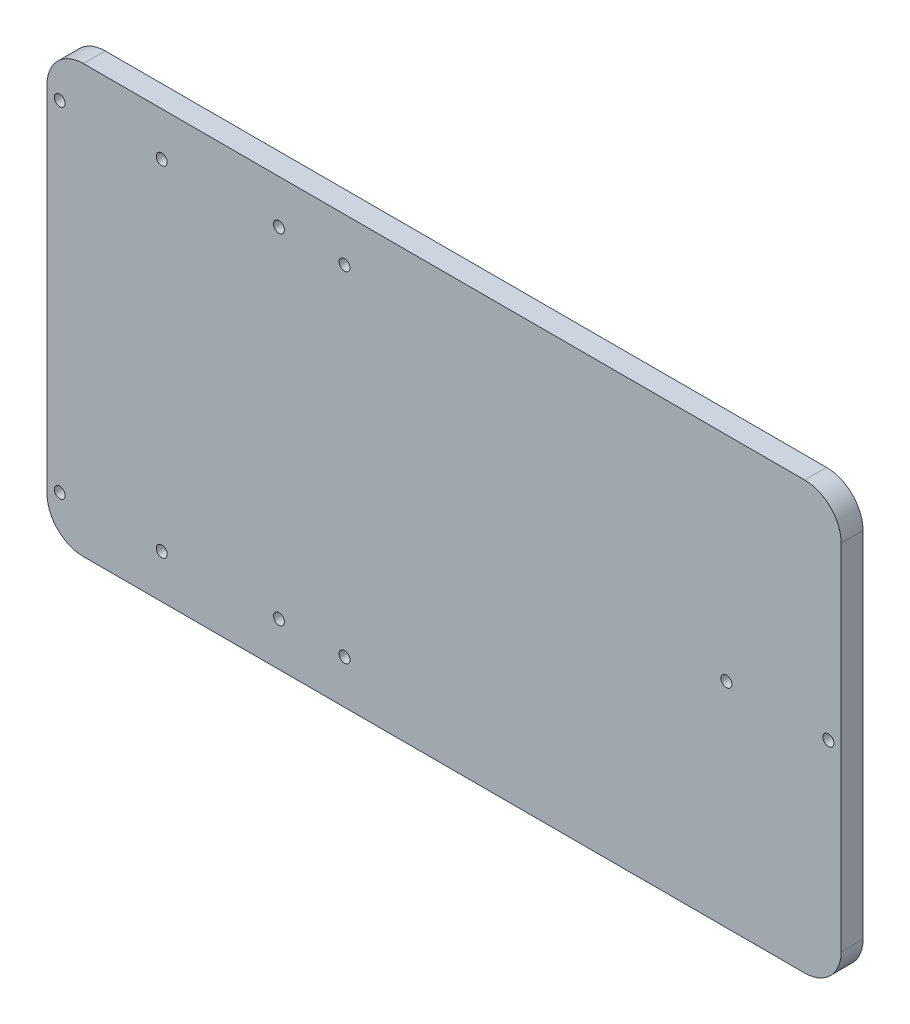
ISO-10303-21;
HEADER;
FILE_DESCRIPTION(('STEP AP214'),'2;1');
FILE_NAME('part.step','',(''),(''),'','','');
FILE_SCHEMA(('AUTOMOTIVE_DESIGN { 1 0 10303 214 1 1 1 1 }'));
ENDSEC;
DATA;
#1=APPLICATION_CONTEXT('core data for automotive mechanical design processes');
#2=APPLICATION_PROTOCOL_DEFINITION('international standard','automotive_design',2000,#1);
#3=PRODUCT_CONTEXT('',#1,'mechanical');
#4=PRODUCT('Part','Part','',(#3));
#5=PRODUCT_RELATED_PRODUCT_CATEGORY('part','',(#4));
#6=PRODUCT_DEFINITION_FORMATION('','',#4);
#7=PRODUCT_DEFINITION_CONTEXT('part definition',#1,'design');
#8=PRODUCT_DEFINITION('design','',#6,#7);
#9=PRODUCT_DEFINITION_SHAPE('','',#8);
#10=(LENGTH_UNIT() NAMED_UNIT(*) SI_UNIT(.MILLI.,.METRE.));
#11=(NAMED_UNIT(*) PLANE_ANGLE_UNIT() SI_UNIT($,.RADIAN.));
#12=(NAMED_UNIT(*) SI_UNIT($,.STERADIAN.) SOLID_ANGLE_UNIT());
#13=UNCERTAINTY_MEASURE_WITH_UNIT(LENGTH_MEASURE(1.E-05),#10,'distance_accuracy_value','');
#14=(GEOMETRIC_REPRESENTATION_CONTEXT(3) GLOBAL_UNCERTAINTY_ASSIGNED_CONTEXT((#13)) GLOBAL_UNIT_ASSIGNED_CONTEXT((#10,
#11,#12)) REPRESENTATION_CONTEXT('',''));
#15=CARTESIAN_POINT('',(0.,0.,0.));
#16=DIRECTION('',(0.,0.,1.));
#17=DIRECTION('',(1.,0.,0.));
#18=AXIS2_PLACEMENT_3D('',#15,#16,#17);
#19=CARTESIAN_POINT('',(0.,0.,6.));
#20=DIRECTION('',(0.,0.,1.));
#21=DIRECTION('',(1.,0.,0.));
#22=AXIS2_PLACEMENT_3D('',#19,#20,#21);
#23=PLANE('',#22);
#24=CARTESIAN_POINT('',(-177.942511077423,244.343600407328,6.));
#25=DIRECTION('',(0.,0.,1.));
#26=DIRECTION('',(1.,0.,0.));
#27=AXIS2_PLACEMENT_3D('',#24,#25,#26);
#28=CIRCLE('',#27,1.5);
#29=CARTESIAN_POINT('',(-176.442511077423,244.343600407328,6.));
#30=VERTEX_POINT('',#29);
#31=EDGE_CURVE('E311',#30,#30,#28,.T.);
#32=ORIENTED_EDGE('',*,*,#31,.F.);
#33=EDGE_LOOP('',(#32));
#34=FACE_BOUND('',#33,.T.);
#35=CARTESIAN_POINT('',(-195.942511077423,244.343600407328,6.));
#36=DIRECTION('',(0.,0.,1.));
#37=DIRECTION('',(1.,0.,0.));
#38=AXIS2_PLACEMENT_3D('',#35,#36,#37);
#39=CIRCLE('',#38,1.5);
#40=CARTESIAN_POINT('',(-194.442511077423,244.343600407328,6.));
#41=VERTEX_POINT('',#40);
#42=EDGE_CURVE('E305',#41,#41,#39,.T.);
#43=ORIENTED_EDGE('',*,*,#42,.F.);
#44=EDGE_LOOP('',(#43));
#45=FACE_BOUND('',#44,.T.);
#46=CARTESIAN_POINT('',(-177.942511077423,151.143600407328,6.));
#47=DIRECTION('',(0.,0.,1.));
#48=DIRECTION('',(1.,0.,0.));
#49=AXIS2_PLACEMENT_3D('',#46,#47,#48);
#50=CIRCLE('',#49,1.5);
#51=CARTESIAN_POINT('',(-176.442511077423,151.143600407328,6.));
#52=VERTEX_POINT('',#51);
#53=EDGE_CURVE('E299',#52,#52,#50,.T.);
#54=ORIENTED_EDGE('',*,*,#53,.F.);
#55=EDGE_LOOP('',(#54));
#56=FACE_BOUND('',#55,.T.);
#57=CARTESIAN_POINT('',(-195.942511077423,151.143600407328,6.));
#58=DIRECTION('',(0.,0.,1.));
#59=DIRECTION('',(1.,0.,0.));
#60=AXIS2_PLACEMENT_3D('',#57,#58,#59);
#61=CIRCLE('',#60,1.5);
#62=CARTESIAN_POINT('',(-194.442511077423,151.143600407328,6.));
#63=VERTEX_POINT('',#62);
#64=EDGE_CURVE('E296',#63,#63,#61,.T.);
#65=ORIENTED_EDGE('',*,*,#64,.F.);
#66=EDGE_LOOP('',(#65));
#67=FACE_BOUND('',#66,.T.);
#68=CARTESIAN_POINT('',(-73.1091777440896,197.743600407328,6.));
#69=DIRECTION('',(0.,0.,1.));
#70=DIRECTION('',(1.,0.,0.));
#71=AXIS2_PLACEMENT_3D('',#68,#69,#70);
#72=CIRCLE('',#71,1.5);
#73=CARTESIAN_POINT('',(-71.6091777440896,197.743600407328,6.));
#74=VERTEX_POINT('',#73);
#75=EDGE_CURVE('E281',#74,#74,#72,.T.);
#76=ORIENTED_EDGE('',*,*,#75,.F.);
#77=EDGE_LOOP('',(#76));
#78=FACE_BOUND('',#77,.T.);
#79=CARTESIAN_POINT('',(-228.10917774409,151.143600407328,6.));
#80=DIRECTION('',(0.,0.,1.));
#81=DIRECTION('',(1.,0.,0.));
#82=AXIS2_PLACEMENT_3D('',#79,#80,#81);
#83=CIRCLE('',#82,1.5);
#84=CARTESIAN_POINT('',(-226.60917774409,151.143600407328,6.));
#85=VERTEX_POINT('',#84);
#86=EDGE_CURVE('E269',#85,#85,#83,.T.);
#87=ORIENTED_EDGE('',*,*,#86,.F.);
#88=EDGE_LOOP('',(#87));
#89=FACE_BOUND('',#88,.T.);
#90=CARTESIAN_POINT('',(-256.10917774409,244.343600407328,6.));
#91=DIRECTION('',(0.,0.,1.));
#92=DIRECTION('',(1.,0.,0.));
#93=AXIS2_PLACEMENT_3D('',#90,#91,#92);
#94=CIRCLE('',#93,1.50000000000002);
#95=CARTESIAN_POINT('',(-254.60917774409,244.343600407328,6.));
#96=VERTEX_POINT('',#95);
#97=EDGE_CURVE('E250',#96,#96,#94,.T.);
#98=ORIENTED_EDGE('',*,*,#97,.F.);
#99=EDGE_LOOP('',(#98));
#100=FACE_BOUND('',#99,.T.);
#101=DIRECTION('',(1.,0.,0.));
#102=VECTOR('',#101,1.);
#103=CARTESIAN_POINT('',(-259.60917774409,139.143600407328,6.));
#104=LINE('',#103,#102);
#105=CARTESIAN_POINT('',(-249.60917774409,139.143600407328,6.));
#106=VERTEX_POINT('',#105);
#107=CARTESIAN_POINT('',(-51.6091777440896,139.143600407328,6.));
#108=VERTEX_POINT('',#107);
#109=EDGE_CURVE('E259',#106,#108,#104,.T.);
#110=ORIENTED_EDGE('',*,*,#109,.T.);
#111=CARTESIAN_POINT('',(-51.6091777440896,149.143600407328,6.));
#112=DIRECTION('',(0.,0.,1.));
#113=DIRECTION('',(1.,0.,0.));
#114=AXIS2_PLACEMENT_3D('',#111,#112,#113);
#115=CIRCLE('',#114,10.);
#116=CARTESIAN_POINT('',(-41.6091777440896,149.143600407328,6.));
#117=VERTEX_POINT('',#116);
#118=EDGE_CURVE('E232',#108,#117,#115,.T.);
#119=ORIENTED_EDGE('',*,*,#118,.T.);
#120=DIRECTION('',(0.,-1.,0.));
#121=VECTOR('',#120,1.);
#122=CARTESIAN_POINT('',(-41.6091777440896,256.343600407328,6.));
#123=LINE('',#122,#121);
#124=CARTESIAN_POINT('',(-41.6091777440896,246.343600407328,6.));
#125=VERTEX_POINT('',#124);
#126=EDGE_CURVE('E215',#125,#117,#123,.T.);
#127=ORIENTED_EDGE('',*,*,#126,.F.);
#128=CARTESIAN_POINT('',(-51.6091777440896,246.343600407328,6.));
#129=DIRECTION('',(0.,0.,1.));
#130=DIRECTION('',(1.,0.,0.));
#131=AXIS2_PLACEMENT_3D('',#128,#129,#130);
#132=CIRCLE('',#131,10.);
#133=CARTESIAN_POINT('',(-51.6091777440896,256.343600407328,6.));
#134=VERTEX_POINT('',#133);
#135=EDGE_CURVE('E137',#125,#134,#132,.T.);
#136=ORIENTED_EDGE('',*,*,#135,.T.);
#137=DIRECTION('',(1.,0.,0.));
#138=VECTOR('',#137,1.);
#139=CARTESIAN_POINT('',(-259.60917774409,256.343600407328,6.));
#140=LINE('',#139,#138);
#141=CARTESIAN_POINT('',(-249.60917774409,256.343600407328,6.));
#142=VERTEX_POINT('',#141);
#143=EDGE_CURVE('E211',#142,#134,#140,.T.);
#144=ORIENTED_EDGE('',*,*,#143,.F.);
#145=CARTESIAN_POINT('',(-249.60917774409,246.343600407328,6.));
#146=DIRECTION('',(0.,0.,1.));
#147=DIRECTION('',(1.,0.,0.));
#148=AXIS2_PLACEMENT_3D('',#145,#146,#147);
#149=CIRCLE('',#148,10.);
#150=CARTESIAN_POINT('',(-259.60917774409,246.343600407328,6.));
#151=VERTEX_POINT('',#150);
#152=EDGE_CURVE('E227',#142,#151,#149,.T.);
#153=ORIENTED_EDGE('',*,*,#152,.T.);
#154=DIRECTION('',(0.,-1.,0.));
#155=VECTOR('',#154,1.);
#156=CARTESIAN_POINT('',(-259.60917774409,256.343600407328,6.));
#157=LINE('',#156,#155);
#158=CARTESIAN_POINT('',(-259.60917774409,149.143600407328,6.));
#159=VERTEX_POINT('',#158);
#160=EDGE_CURVE('E246',#151,#159,#157,.T.);
#161=ORIENTED_EDGE('',*,*,#160,.T.);
#162=CARTESIAN_POINT('',(-249.60917774409,149.143600407328,6.));
#163=DIRECTION('',(0.,0.,1.));
#164=DIRECTION('',(1.,0.,0.));
#165=AXIS2_PLACEMENT_3D('',#162,#163,#164);
#166=CIRCLE('',#165,10.);
#167=EDGE_CURVE('E229',#159,#106,#166,.T.);
#168=ORIENTED_EDGE('',*,*,#167,.T.);
#169=EDGE_LOOP('',(#110,#119,#127,#136,#144,#153,#161,#168));
#170=FACE_BOUND('',#169,.T.);
#171=CARTESIAN_POINT('',(-228.10917774409,244.343600407328,6.));
#172=DIRECTION('',(0.,0.,1.));
#173=DIRECTION('',(1.,0.,0.));
#174=AXIS2_PLACEMENT_3D('',#171,#172,#173);
#175=CIRCLE('',#174,1.5);
#176=CARTESIAN_POINT('',(-226.60917774409,244.343600407328,6.));
#177=VERTEX_POINT('',#176);
#178=EDGE_CURVE('E264',#177,#177,#175,.T.);
#179=ORIENTED_EDGE('',*,*,#178,.F.);
#180=EDGE_LOOP('',(#179));
#181=FACE_BOUND('',#180,.T.);
#182=CARTESIAN_POINT('',(-45.1091777440896,197.743600407328,6.));
#183=DIRECTION('',(0.,0.,1.));
#184=DIRECTION('',(1.,0.,0.));
#185=AXIS2_PLACEMENT_3D('',#182,#183,#184);
#186=CIRCLE('',#185,1.5);
#187=CARTESIAN_POINT('',(-43.6091777440896,197.743600407328,6.));
#188=VERTEX_POINT('',#187);
#189=EDGE_CURVE('E275',#188,#188,#186,.T.);
#190=ORIENTED_EDGE('',*,*,#189,.F.);
#191=EDGE_LOOP('',(#190));
#192=FACE_BOUND('',#191,.T.);
#193=CARTESIAN_POINT('',(-256.10917774409,151.143600407328,6.));
#194=DIRECTION('',(0.,0.,1.));
#195=DIRECTION('',(1.,0.,0.));
#196=AXIS2_PLACEMENT_3D('',#193,#194,#195);
#197=CIRCLE('',#196,1.50000000000002);
#198=CARTESIAN_POINT('',(-254.60917774409,151.143600407328,6.));
#199=VERTEX_POINT('',#198);
#200=EDGE_CURVE('E287',#199,#199,#197,.T.);
#201=ORIENTED_EDGE('',*,*,#200,.F.);
#202=EDGE_LOOP('',(#201));
#203=FACE_BOUND('',#202,.T.);
#204=ADVANCED_FACE('F122',(#34,#45,#56,#67,#78,#89,#100,#170,#181,#192,#203),#23,.T.);
#205=CARTESIAN_POINT('',(0.,0.,0.));
#206=DIRECTION('',(0.,0.,1.));
#207=DIRECTION('',(1.,0.,0.));
#208=AXIS2_PLACEMENT_3D('',#205,#206,#207);
#209=PLANE('',#208);
#210=CARTESIAN_POINT('',(-177.942511077423,244.343600407328,0.));
#211=DIRECTION('',(0.,0.,1.));
#212=DIRECTION('',(1.,0.,0.));
#213=AXIS2_PLACEMENT_3D('',#210,#211,#212);
#214=CIRCLE('',#213,1.5);
#215=CARTESIAN_POINT('',(-176.442511077423,244.343600407328,0.));
#216=VERTEX_POINT('',#215);
#217=EDGE_CURVE('E314',#216,#216,#214,.T.);
#218=ORIENTED_EDGE('',*,*,#217,.T.);
#219=EDGE_LOOP('',(#218));
#220=FACE_BOUND('',#219,.T.);
#221=CARTESIAN_POINT('',(-195.942511077423,244.343600407328,0.));
#222=DIRECTION('',(0.,0.,1.));
#223=DIRECTION('',(1.,0.,0.));
#224=AXIS2_PLACEMENT_3D('',#221,#222,#223);
#225=CIRCLE('',#224,1.5);
#226=CARTESIAN_POINT('',(-194.442511077423,244.343600407328,0.));
#227=VERTEX_POINT('',#226);
#228=EDGE_CURVE('E308',#227,#227,#225,.T.);
#229=ORIENTED_EDGE('',*,*,#228,.T.);
#230=EDGE_LOOP('',(#229));
#231=FACE_BOUND('',#230,.T.);
#232=CARTESIAN_POINT('',(-177.942511077423,151.143600407328,0.));
#233=DIRECTION('',(0.,0.,1.));
#234=DIRECTION('',(1.,0.,0.));
#235=AXIS2_PLACEMENT_3D('',#232,#233,#234);
#236=CIRCLE('',#235,1.5);
#237=CARTESIAN_POINT('',(-176.442511077423,151.143600407328,0.));
#238=VERTEX_POINT('',#237);
#239=EDGE_CURVE('E302',#238,#238,#236,.T.);
#240=ORIENTED_EDGE('',*,*,#239,.T.);
#241=EDGE_LOOP('',(#240));
#242=FACE_BOUND('',#241,.T.);
#243=CARTESIAN_POINT('',(-195.942511077423,151.143600407328,0.));
#244=DIRECTION('',(0.,0.,1.));
#245=DIRECTION('',(1.,0.,0.));
#246=AXIS2_PLACEMENT_3D('',#243,#244,#245);
#247=CIRCLE('',#246,1.5);
#248=CARTESIAN_POINT('',(-194.442511077423,151.143600407328,0.));
#249=VERTEX_POINT('',#248);
#250=EDGE_CURVE('E293',#249,#249,#247,.T.);
#251=ORIENTED_EDGE('',*,*,#250,.T.);
#252=EDGE_LOOP('',(#251));
#253=FACE_BOUND('',#252,.T.);
#254=CARTESIAN_POINT('',(-73.1091777440896,197.743600407328,0.));
#255=DIRECTION('',(0.,0.,1.));
#256=DIRECTION('',(1.,0.,0.));
#257=AXIS2_PLACEMENT_3D('',#254,#255,#256);
#258=CIRCLE('',#257,1.5);
#259=CARTESIAN_POINT('',(-71.6091777440896,197.743600407328,0.));
#260=VERTEX_POINT('',#259);
#261=EDGE_CURVE('E284',#260,#260,#258,.T.);
#262=ORIENTED_EDGE('',*,*,#261,.T.);
#263=EDGE_LOOP('',(#262));
#264=FACE_BOUND('',#263,.T.);
#265=CARTESIAN_POINT('',(-228.10917774409,151.143600407328,0.));
#266=DIRECTION('',(0.,0.,1.));
#267=DIRECTION('',(1.,0.,0.));
#268=AXIS2_PLACEMENT_3D('',#265,#266,#267);
#269=CIRCLE('',#268,1.5);
#270=CARTESIAN_POINT('',(-226.60917774409,151.143600407328,0.));
#271=VERTEX_POINT('',#270);
#272=EDGE_CURVE('E272',#271,#271,#269,.T.);
#273=ORIENTED_EDGE('',*,*,#272,.T.);
#274=EDGE_LOOP('',(#273));
#275=FACE_BOUND('',#274,.T.);
#276=CARTESIAN_POINT('',(-256.10917774409,244.343600407328,0.));
#277=DIRECTION('',(0.,0.,1.));
#278=DIRECTION('',(1.,0.,0.));
#279=AXIS2_PLACEMENT_3D('',#276,#277,#278);
#280=CIRCLE('',#279,1.50000000000002);
#281=CARTESIAN_POINT('',(-254.60917774409,244.343600407328,0.));
#282=VERTEX_POINT('',#281);
#283=EDGE_CURVE('E255',#282,#282,#280,.T.);
#284=ORIENTED_EDGE('',*,*,#283,.T.);
#285=EDGE_LOOP('',(#284));
#286=FACE_BOUND('',#285,.T.);
#287=DIRECTION('',(0.,-1.,0.));
#288=VECTOR('',#287,1.);
#289=CARTESIAN_POINT('',(-41.6091777440896,256.343600407328,0.));
#290=LINE('',#289,#288);
#291=CARTESIAN_POINT('',(-41.6091777440896,246.343600407328,0.));
#292=VERTEX_POINT('',#291);
#293=CARTESIAN_POINT('',(-41.6091777440896,149.143600407328,0.));
#294=VERTEX_POINT('',#293);
#295=EDGE_CURVE('E192',#292,#294,#290,.T.);
#296=ORIENTED_EDGE('',*,*,#295,.T.);
#297=CARTESIAN_POINT('',(-51.6091777440896,149.143600407328,0.));
#298=DIRECTION('',(0.,0.,1.));
#299=DIRECTION('',(1.,0.,0.));
#300=AXIS2_PLACEMENT_3D('',#297,#298,#299);
#301=CIRCLE('',#300,10.);
#302=CARTESIAN_POINT('',(-51.6091777440896,139.143600407328,0.));
#303=VERTEX_POINT('',#302);
#304=EDGE_CURVE('E198',#294,#303,#301,.F.);
#305=ORIENTED_EDGE('',*,*,#304,.T.);
#306=DIRECTION('',(1.,0.,0.));
#307=VECTOR('',#306,1.);
#308=CARTESIAN_POINT('',(-259.60917774409,139.143600407328,0.));
#309=LINE('',#308,#307);
#310=CARTESIAN_POINT('',(-249.60917774409,139.143600407328,0.));
#311=VERTEX_POINT('',#310);
#312=EDGE_CURVE('E208',#311,#303,#309,.T.);
#313=ORIENTED_EDGE('',*,*,#312,.F.);
#314=CARTESIAN_POINT('',(-249.60917774409,149.143600407328,0.));
#315=DIRECTION('',(0.,0.,1.));
#316=DIRECTION('',(1.,0.,0.));
#317=AXIS2_PLACEMENT_3D('',#314,#315,#316);
#318=CIRCLE('',#317,10.);
#319=CARTESIAN_POINT('',(-259.60917774409,149.143600407328,0.));
#320=VERTEX_POINT('',#319);
#321=EDGE_CURVE('E199',#311,#320,#318,.F.);
#322=ORIENTED_EDGE('',*,*,#321,.T.);
#323=DIRECTION('',(0.,-1.,0.));
#324=VECTOR('',#323,1.);
#325=CARTESIAN_POINT('',(-259.60917774409,256.343600407328,0.));
#326=LINE('',#325,#324);
#327=CARTESIAN_POINT('',(-259.60917774409,246.343600407328,0.));
#328=VERTEX_POINT('',#327);
#329=EDGE_CURVE('E243',#328,#320,#326,.T.);
#330=ORIENTED_EDGE('',*,*,#329,.F.);
#331=CARTESIAN_POINT('',(-249.60917774409,246.343600407328,0.));
#332=DIRECTION('',(0.,0.,1.));
#333=DIRECTION('',(1.,0.,0.));
#334=AXIS2_PLACEMENT_3D('',#331,#332,#333);
#335=CIRCLE('',#334,10.);
#336=CARTESIAN_POINT('',(-249.60917774409,256.343600407328,0.));
#337=VERTEX_POINT('',#336);
#338=EDGE_CURVE('E213',#328,#337,#335,.F.);
#339=ORIENTED_EDGE('',*,*,#338,.T.);
#340=DIRECTION('',(1.,0.,0.));
#341=VECTOR('',#340,1.);
#342=CARTESIAN_POINT('',(-259.60917774409,256.343600407328,0.));
#343=LINE('',#342,#341);
#344=CARTESIAN_POINT('',(-51.6091777440896,256.343600407328,0.));
#345=VERTEX_POINT('',#344);
#346=EDGE_CURVE('E193',#337,#345,#343,.T.);
#347=ORIENTED_EDGE('',*,*,#346,.T.);
#348=CARTESIAN_POINT('',(-51.6091777440896,246.343600407328,0.));
#349=DIRECTION('',(0.,0.,1.));
#350=DIRECTION('',(1.,0.,0.));
#351=AXIS2_PLACEMENT_3D('',#348,#349,#350);
#352=CIRCLE('',#351,10.);
#353=EDGE_CURVE('E188',#345,#292,#352,.F.);
#354=ORIENTED_EDGE('',*,*,#353,.T.);
#355=EDGE_LOOP('',(#296,#305,#313,#322,#330,#339,#347,#354));
#356=FACE_BOUND('',#355,.T.);
#357=CARTESIAN_POINT('',(-228.10917774409,244.343600407328,0.));
#358=DIRECTION('',(0.,0.,1.));
#359=DIRECTION('',(1.,0.,0.));
#360=AXIS2_PLACEMENT_3D('',#357,#358,#359);
#361=CIRCLE('',#360,1.5);
#362=CARTESIAN_POINT('',(-226.60917774409,244.343600407328,0.));
#363=VERTEX_POINT('',#362);
#364=EDGE_CURVE('E266',#363,#363,#361,.T.);
#365=ORIENTED_EDGE('',*,*,#364,.T.);
#366=EDGE_LOOP('',(#365));
#367=FACE_BOUND('',#366,.T.);
#368=CARTESIAN_POINT('',(-45.1091777440896,197.743600407328,0.));
#369=DIRECTION('',(0.,0.,1.));
#370=DIRECTION('',(1.,0.,0.));
#371=AXIS2_PLACEMENT_3D('',#368,#369,#370);
#372=CIRCLE('',#371,1.5);
#373=CARTESIAN_POINT('',(-43.6091777440896,197.743600407328,0.));
#374=VERTEX_POINT('',#373);
#375=EDGE_CURVE('E278',#374,#374,#372,.T.);
#376=ORIENTED_EDGE('',*,*,#375,.T.);
#377=EDGE_LOOP('',(#376));
#378=FACE_BOUND('',#377,.T.);
#379=CARTESIAN_POINT('',(-256.10917774409,151.143600407328,0.));
#380=DIRECTION('',(0.,0.,1.));
#381=DIRECTION('',(1.,0.,0.));
#382=AXIS2_PLACEMENT_3D('',#379,#380,#381);
#383=CIRCLE('',#382,1.50000000000002);
#384=CARTESIAN_POINT('',(-254.60917774409,151.143600407328,0.));
#385=VERTEX_POINT('',#384);
#386=EDGE_CURVE('E290',#385,#385,#383,.T.);
#387=ORIENTED_EDGE('',*,*,#386,.T.);
#388=EDGE_LOOP('',(#387));
#389=FACE_BOUND('',#388,.T.);
#390=ADVANCED_FACE('F190',(#220,#231,#242,#253,#264,#275,#286,#356,#367,#378,#389),#209,.F.);
#391=CARTESIAN_POINT('',(-259.60917774409,256.343600407328,6.));
#392=DIRECTION('',(1.,0.,0.));
#393=DIRECTION('',(0.,0.,-1.));
#394=AXIS2_PLACEMENT_3D('',#391,#392,#393);
#395=PLANE('',#394);
#396=ORIENTED_EDGE('',*,*,#329,.T.);
#397=DIRECTION('',(0.,0.,-1.));
#398=VECTOR('',#397,1.);
#399=CARTESIAN_POINT('',(-259.60917774409,149.143600407328,6.));
#400=LINE('',#399,#398);
#401=EDGE_CURVE('E12',#320,#159,#400,.F.);
#402=ORIENTED_EDGE('',*,*,#401,.T.);
#403=ORIENTED_EDGE('',*,*,#160,.F.);
#404=DIRECTION('',(0.,0.,-1.));
#405=VECTOR('',#404,1.);
#406=CARTESIAN_POINT('',(-259.60917774409,246.343600407328,0.));
#407=LINE('',#406,#405);
#408=EDGE_CURVE('E130',#151,#328,#407,.T.);
#409=ORIENTED_EDGE('',*,*,#408,.T.);
#410=EDGE_LOOP('',(#396,#402,#403,#409));
#411=FACE_BOUND('',#410,.T.);
#412=ADVANCED_FACE('F242',(#411),#395,.F.);
#413=CARTESIAN_POINT('',(-259.60917774409,139.143600407328,6.));
#414=DIRECTION('',(0.,1.,0.));
#415=DIRECTION('',(0.,0.,1.));
#416=AXIS2_PLACEMENT_3D('',#413,#414,#415);
#417=PLANE('',#416);
#418=ORIENTED_EDGE('',*,*,#312,.T.);
#419=DIRECTION('',(0.,0.,-1.));
#420=VECTOR('',#419,1.);
#421=CARTESIAN_POINT('',(-51.6091777440896,139.143600407328,6.));
#422=LINE('',#421,#420);
#423=EDGE_CURVE('E225',#303,#108,#422,.F.);
#424=ORIENTED_EDGE('',*,*,#423,.T.);
#425=ORIENTED_EDGE('',*,*,#109,.F.);
#426=DIRECTION('',(0.,0.,-1.));
#427=VECTOR('',#426,1.);
#428=CARTESIAN_POINT('',(-249.60917774409,139.143600407328,6.));
#429=LINE('',#428,#427);
#430=EDGE_CURVE('E222',#106,#311,#429,.T.);
#431=ORIENTED_EDGE('',*,*,#430,.T.);
#432=EDGE_LOOP('',(#418,#424,#425,#431));
#433=FACE_BOUND('',#432,.T.);
#434=ADVANCED_FACE('F359',(#433),#417,.F.);
#435=CARTESIAN_POINT('',(-41.6091777440896,256.343600407328,6.));
#436=DIRECTION('',(1.,0.,0.));
#437=DIRECTION('',(0.,0.,-1.));
#438=AXIS2_PLACEMENT_3D('',#435,#436,#437);
#439=PLANE('',#438);
#440=ORIENTED_EDGE('',*,*,#126,.T.);
#441=DIRECTION('',(0.,0.,-1.));
#442=VECTOR('',#441,1.);
#443=CARTESIAN_POINT('',(-41.6091777440896,149.143600407328,0.));
#444=LINE('',#443,#442);
#445=EDGE_CURVE('E207',#117,#294,#444,.T.);
#446=ORIENTED_EDGE('',*,*,#445,.T.);
#447=ORIENTED_EDGE('',*,*,#295,.F.);
#448=DIRECTION('',(0.,0.,-1.));
#449=VECTOR('',#448,1.);
#450=CARTESIAN_POINT('',(-41.6091777440896,246.343600407328,6.));
#451=LINE('',#450,#449);
#452=EDGE_CURVE('E205',#292,#125,#451,.F.);
#453=ORIENTED_EDGE('',*,*,#452,.T.);
#454=EDGE_LOOP('',(#440,#446,#447,#453));
#455=FACE_BOUND('',#454,.T.);
#456=ADVANCED_FACE('F204',(#455),#439,.T.);
#457=CARTESIAN_POINT('',(-259.60917774409,256.343600407328,6.));
#458=DIRECTION('',(0.,1.,0.));
#459=DIRECTION('',(0.,0.,1.));
#460=AXIS2_PLACEMENT_3D('',#457,#458,#459);
#461=PLANE('',#460);
#462=ORIENTED_EDGE('',*,*,#143,.T.);
#463=DIRECTION('',(0.,0.,-1.));
#464=VECTOR('',#463,1.);
#465=CARTESIAN_POINT('',(-51.6091777440896,256.343600407328,6.));
#466=LINE('',#465,#464);
#467=EDGE_CURVE('E235',#134,#345,#466,.T.);
#468=ORIENTED_EDGE('',*,*,#467,.T.);
#469=ORIENTED_EDGE('',*,*,#346,.F.);
#470=DIRECTION('',(0.,0.,-1.));
#471=VECTOR('',#470,1.);
#472=CARTESIAN_POINT('',(-249.60917774409,256.343600407328,6.));
#473=LINE('',#472,#471);
#474=EDGE_CURVE('E144',#337,#142,#473,.F.);
#475=ORIENTED_EDGE('',*,*,#474,.T.);
#476=EDGE_LOOP('',(#462,#468,#469,#475));
#477=FACE_BOUND('',#476,.T.);
#478=ADVANCED_FACE('F364',(#477),#461,.T.);
#479=CARTESIAN_POINT('',(-256.10917774409,244.343600407328,6.));
#480=DIRECTION('',(0.,0.,-1.));
#481=DIRECTION('',(-1.,0.,0.));
#482=AXIS2_PLACEMENT_3D('',#479,#480,#481);
#483=CYLINDRICAL_SURFACE('',#482,1.50000000000002);
#484=ORIENTED_EDGE('',*,*,#97,.T.);
#485=EDGE_LOOP('',(#484));
#486=FACE_BOUND('',#485,.T.);
#487=ORIENTED_EDGE('',*,*,#283,.F.);
#488=EDGE_LOOP('',(#487));
#489=FACE_BOUND('',#488,.T.);
#490=ADVANCED_FACE('F367',(#486,#489),#483,.F.);
#491=CARTESIAN_POINT('',(-228.10917774409,244.343600407328,6.));
#492=DIRECTION('',(0.,0.,-1.));
#493=DIRECTION('',(-1.,0.,0.));
#494=AXIS2_PLACEMENT_3D('',#491,#492,#493);
#495=CYLINDRICAL_SURFACE('',#494,1.5);
#496=ORIENTED_EDGE('',*,*,#178,.T.);
#497=EDGE_LOOP('',(#496));
#498=FACE_BOUND('',#497,.T.);
#499=ORIENTED_EDGE('',*,*,#364,.F.);
#500=EDGE_LOOP('',(#499));
#501=FACE_BOUND('',#500,.T.);
#502=ADVANCED_FACE('F510',(#498,#501),#495,.F.);
#503=CARTESIAN_POINT('',(-228.10917774409,151.143600407328,6.));
#504=DIRECTION('',(0.,0.,-1.));
#505=DIRECTION('',(-1.,0.,0.));
#506=AXIS2_PLACEMENT_3D('',#503,#504,#505);
#507=CYLINDRICAL_SURFACE('',#506,1.5);
#508=ORIENTED_EDGE('',*,*,#86,.T.);
#509=EDGE_LOOP('',(#508));
#510=FACE_BOUND('',#509,.T.);
#511=ORIENTED_EDGE('',*,*,#272,.F.);
#512=EDGE_LOOP('',(#511));
#513=FACE_BOUND('',#512,.T.);
#514=ADVANCED_FACE('F500',(#510,#513),#507,.F.);
#515=CARTESIAN_POINT('',(-45.1091777440896,197.743600407328,6.));
#516=DIRECTION('',(0.,0.,-1.));
#517=DIRECTION('',(-1.,0.,0.));
#518=AXIS2_PLACEMENT_3D('',#515,#516,#517);
#519=CYLINDRICAL_SURFACE('',#518,1.5);
#520=ORIENTED_EDGE('',*,*,#189,.T.);
#521=EDGE_LOOP('',(#520));
#522=FACE_BOUND('',#521,.T.);
#523=ORIENTED_EDGE('',*,*,#375,.F.);
#524=EDGE_LOOP('',(#523));
#525=FACE_BOUND('',#524,.T.);
#526=ADVANCED_FACE('F490',(#522,#525),#519,.F.);
#527=CARTESIAN_POINT('',(-73.1091777440896,197.743600407328,6.));
#528=DIRECTION('',(0.,0.,-1.));
#529=DIRECTION('',(-1.,0.,0.));
#530=AXIS2_PLACEMENT_3D('',#527,#528,#529);
#531=CYLINDRICAL_SURFACE('',#530,1.5);
#532=ORIENTED_EDGE('',*,*,#75,.T.);
#533=EDGE_LOOP('',(#532));
#534=FACE_BOUND('',#533,.T.);
#535=ORIENTED_EDGE('',*,*,#261,.F.);
#536=EDGE_LOOP('',(#535));
#537=FACE_BOUND('',#536,.T.);
#538=ADVANCED_FACE('F349',(#534,#537),#531,.F.);
#539=CARTESIAN_POINT('',(-256.10917774409,151.143600407328,6.));
#540=DIRECTION('',(0.,0.,-1.));
#541=DIRECTION('',(-1.,0.,0.));
#542=AXIS2_PLACEMENT_3D('',#539,#540,#541);
#543=CYLINDRICAL_SURFACE('',#542,1.50000000000002);
#544=ORIENTED_EDGE('',*,*,#200,.T.);
#545=EDGE_LOOP('',(#544));
#546=FACE_BOUND('',#545,.T.);
#547=ORIENTED_EDGE('',*,*,#386,.F.);
#548=EDGE_LOOP('',(#547));
#549=FACE_BOUND('',#548,.T.);
#550=ADVANCED_FACE('F345',(#546,#549),#543,.F.);
#551=CARTESIAN_POINT('',(-195.942511077423,151.143600407328,0.));
#552=DIRECTION('',(0.,0.,1.));
#553=DIRECTION('',(1.,0.,0.));
#554=AXIS2_PLACEMENT_3D('',#551,#552,#553);
#555=CYLINDRICAL_SURFACE('',#554,1.5);
#556=ORIENTED_EDGE('',*,*,#250,.F.);
#557=EDGE_LOOP('',(#556));
#558=FACE_BOUND('',#557,.T.);
#559=ORIENTED_EDGE('',*,*,#64,.T.);
#560=EDGE_LOOP('',(#559));
#561=FACE_BOUND('',#560,.T.);
#562=ADVANCED_FACE('F348',(#558,#561),#555,.F.);
#563=CARTESIAN_POINT('',(-177.942511077423,151.143600407328,0.));
#564=DIRECTION('',(0.,0.,1.));
#565=DIRECTION('',(1.,0.,0.));
#566=AXIS2_PLACEMENT_3D('',#563,#564,#565);
#567=CYLINDRICAL_SURFACE('',#566,1.5);
#568=ORIENTED_EDGE('',*,*,#239,.F.);
#569=EDGE_LOOP('',(#568));
#570=FACE_BOUND('',#569,.T.);
#571=ORIENTED_EDGE('',*,*,#53,.T.);
#572=EDGE_LOOP('',(#571));
#573=FACE_BOUND('',#572,.T.);
#574=ADVANCED_FACE('F456',(#570,#573),#567,.F.);
#575=CARTESIAN_POINT('',(-195.942511077423,244.343600407328,0.));
#576=DIRECTION('',(0.,0.,1.));
#577=DIRECTION('',(1.,0.,0.));
#578=AXIS2_PLACEMENT_3D('',#575,#576,#577);
#579=CYLINDRICAL_SURFACE('',#578,1.5);
#580=ORIENTED_EDGE('',*,*,#228,.F.);
#581=EDGE_LOOP('',(#580));
#582=FACE_BOUND('',#581,.T.);
#583=ORIENTED_EDGE('',*,*,#42,.T.);
#584=EDGE_LOOP('',(#583));
#585=FACE_BOUND('',#584,.T.);
#586=ADVANCED_FACE('F446',(#582,#585),#579,.F.);
#587=CARTESIAN_POINT('',(-177.942511077423,244.343600407328,0.));
#588=DIRECTION('',(0.,0.,1.));
#589=DIRECTION('',(1.,0.,0.));
#590=AXIS2_PLACEMENT_3D('',#587,#588,#589);
#591=CYLINDRICAL_SURFACE('',#590,1.5);
#592=ORIENTED_EDGE('',*,*,#217,.F.);
#593=EDGE_LOOP('',(#592));
#594=FACE_BOUND('',#593,.T.);
#595=ORIENTED_EDGE('',*,*,#31,.T.);
#596=EDGE_LOOP('',(#595));
#597=FACE_BOUND('',#596,.T.);
#598=ADVANCED_FACE('F320',(#594,#597),#591,.F.);
#599=CARTESIAN_POINT('',(-51.6091777440896,149.143600407328,6.));
#600=DIRECTION('',(0.,0.,1.));
#601=DIRECTION('',(1.,0.,0.));
#602=AXIS2_PLACEMENT_3D('',#599,#600,#601);
#603=CYLINDRICAL_SURFACE('',#602,10.);
#604=ORIENTED_EDGE('',*,*,#118,.F.);
#605=ORIENTED_EDGE('',*,*,#423,.F.);
#606=ORIENTED_EDGE('',*,*,#304,.F.);
#607=ORIENTED_EDGE('',*,*,#445,.F.);
#608=EDGE_LOOP('',(#604,#605,#606,#607));
#609=FACE_BOUND('',#608,.T.);
#610=ADVANCED_FACE('F373',(#609),#603,.T.);
#611=CARTESIAN_POINT('',(-51.6091777440896,246.343600407328,6.));
#612=DIRECTION('',(0.,0.,-1.));
#613=DIRECTION('',(-1.,0.,0.));
#614=AXIS2_PLACEMENT_3D('',#611,#612,#613);
#615=CYLINDRICAL_SURFACE('',#614,10.);
#616=ORIENTED_EDGE('',*,*,#135,.F.);
#617=ORIENTED_EDGE('',*,*,#452,.F.);
#618=ORIENTED_EDGE('',*,*,#353,.F.);
#619=ORIENTED_EDGE('',*,*,#467,.F.);
#620=EDGE_LOOP('',(#616,#617,#618,#619));
#621=FACE_BOUND('',#620,.T.);
#622=ADVANCED_FACE('F210',(#621),#615,.T.);
#623=CARTESIAN_POINT('',(-249.60917774409,149.143600407328,6.));
#624=DIRECTION('',(0.,0.,-1.));
#625=DIRECTION('',(-1.,0.,0.));
#626=AXIS2_PLACEMENT_3D('',#623,#624,#625);
#627=CYLINDRICAL_SURFACE('',#626,10.);
#628=ORIENTED_EDGE('',*,*,#167,.F.);
#629=ORIENTED_EDGE('',*,*,#401,.F.);
#630=ORIENTED_EDGE('',*,*,#321,.F.);
#631=ORIENTED_EDGE('',*,*,#430,.F.);
#632=EDGE_LOOP('',(#628,#629,#630,#631));
#633=FACE_BOUND('',#632,.T.);
#634=ADVANCED_FACE('F378',(#633),#627,.T.);
#635=CARTESIAN_POINT('',(-249.60917774409,246.343600407328,6.));
#636=DIRECTION('',(0.,0.,1.));
#637=DIRECTION('',(1.,0.,0.));
#638=AXIS2_PLACEMENT_3D('',#635,#636,#637);
#639=CYLINDRICAL_SURFACE('',#638,10.);
#640=ORIENTED_EDGE('',*,*,#152,.F.);
#641=ORIENTED_EDGE('',*,*,#474,.F.);
#642=ORIENTED_EDGE('',*,*,#338,.F.);
#643=ORIENTED_EDGE('',*,*,#408,.F.);
#644=EDGE_LOOP('',(#640,#641,#642,#643));
#645=FACE_BOUND('',#644,.T.);
#646=ADVANCED_FACE('F124',(#645),#639,.T.);
#647=CLOSED_SHELL('',(#204,#390,#412,#434,#456,#478,#490,#502,#514,#526,#538,#550,#562,#574,
#586,#598,#610,#622,#634,#646));
#648=MANIFOLD_SOLID_BREP('B2',#647);
#649=ADVANCED_BREP_SHAPE_REPRESENTATION('',(#18,#648),#14);
#650=SHAPE_DEFINITION_REPRESENTATION(#9,#649);
ENDSEC;
END-ISO-10303-21;
